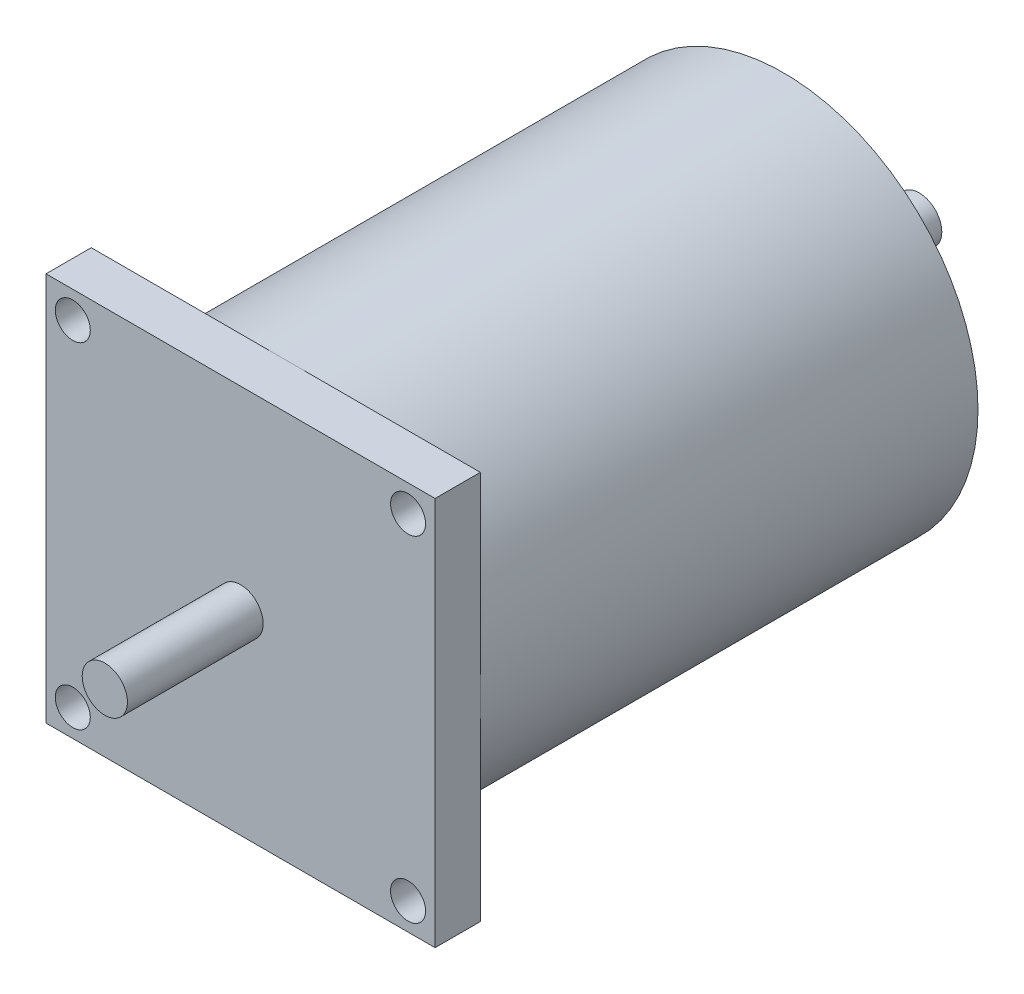
ISO-10303-21;
HEADER;
FILE_DESCRIPTION(('STEP AP214'),'2;1');
FILE_NAME('part.step','',(''),(''),'','','');
FILE_SCHEMA(('AUTOMOTIVE_DESIGN { 1 0 10303 214 1 1 1 1 }'));
ENDSEC;
DATA;
#1=APPLICATION_CONTEXT('core data for automotive mechanical design processes');
#2=APPLICATION_PROTOCOL_DEFINITION('international standard','automotive_design',2000,#1);
#3=PRODUCT_CONTEXT('',#1,'mechanical');
#4=PRODUCT('Part','Part','',(#3));
#5=PRODUCT_RELATED_PRODUCT_CATEGORY('part','',(#4));
#6=PRODUCT_DEFINITION_FORMATION('','',#4);
#7=PRODUCT_DEFINITION_CONTEXT('part definition',#1,'design');
#8=PRODUCT_DEFINITION('design','',#6,#7);
#9=PRODUCT_DEFINITION_SHAPE('','',#8);
#10=(LENGTH_UNIT() NAMED_UNIT(*) SI_UNIT(.MILLI.,.METRE.));
#11=(NAMED_UNIT(*) PLANE_ANGLE_UNIT() SI_UNIT($,.RADIAN.));
#12=(NAMED_UNIT(*) SI_UNIT($,.STERADIAN.) SOLID_ANGLE_UNIT());
#13=UNCERTAINTY_MEASURE_WITH_UNIT(LENGTH_MEASURE(1.E-05),#10,'distance_accuracy_value','');
#14=(GEOMETRIC_REPRESENTATION_CONTEXT(3) GLOBAL_UNCERTAINTY_ASSIGNED_CONTEXT((#13)) GLOBAL_UNIT_ASSIGNED_CONTEXT((#10,
#11,#12)) REPRESENTATION_CONTEXT('',''));
#15=CARTESIAN_POINT('',(0.,0.,0.));
#16=DIRECTION('',(0.,0.,1.));
#17=DIRECTION('',(1.,0.,0.));
#18=AXIS2_PLACEMENT_3D('',#15,#16,#17);
#19=CARTESIAN_POINT('',(0.,0.,0.));
#20=DIRECTION('',(0.,0.,1.));
#21=DIRECTION('',(1.,0.,0.));
#22=AXIS2_PLACEMENT_3D('',#19,#20,#21);
#23=PLANE('',#22);
#24=CARTESIAN_POINT('',(0.,0.,0.));
#25=DIRECTION('',(0.,0.,-1.));
#26=DIRECTION('',(-1.,0.,0.));
#27=AXIS2_PLACEMENT_3D('',#24,#25,#26);
#28=CIRCLE('',#27,27.305);
#29=CARTESIAN_POINT('',(-27.305,0.,0.));
#30=VERTEX_POINT('',#29);
#31=CARTESIAN_POINT('',(0.,27.305,0.));
#32=VERTEX_POINT('',#31);
#33=EDGE_CURVE('E43',#30,#32,#28,.T.);
#34=ORIENTED_EDGE('',*,*,#33,.F.);
#35=DIRECTION('',(0.,-1.,0.));
#36=VECTOR('',#35,1.);
#37=CARTESIAN_POINT('',(-27.305,27.305,0.));
#38=LINE('',#37,#36);
#39=CARTESIAN_POINT('',(-27.305,27.305,0.));
#40=VERTEX_POINT('',#39);
#41=EDGE_CURVE('E90',#40,#30,#38,.T.);
#42=ORIENTED_EDGE('',*,*,#41,.F.);
#43=DIRECTION('',(-1.,0.,0.));
#44=VECTOR('',#43,1.);
#45=CARTESIAN_POINT('',(-27.305,27.305,0.));
#46=LINE('',#45,#44);
#47=EDGE_CURVE('E109',#32,#40,#46,.T.);
#48=ORIENTED_EDGE('',*,*,#47,.F.);
#49=EDGE_LOOP('',(#34,#42,#48));
#50=FACE_BOUND('',#49,.T.);
#51=CARTESIAN_POINT('',(-23.5458,23.5458,0.));
#52=DIRECTION('',(0.,0.,1.));
#53=DIRECTION('',(1.,0.,0.));
#54=AXIS2_PLACEMENT_3D('',#51,#52,#53);
#55=CIRCLE('',#54,2.45745);
#56=CARTESIAN_POINT('',(-21.08835,23.5458,0.));
#57=VERTEX_POINT('',#56);
#58=EDGE_CURVE('E122',#57,#57,#55,.T.);
#59=ORIENTED_EDGE('',*,*,#58,.T.);
#60=EDGE_LOOP('',(#59));
#61=FACE_BOUND('',#60,.T.);
#62=ADVANCED_FACE('F32',(#50,#61),#23,.F.);
#63=CARTESIAN_POINT('',(27.305,0.,0.));
#64=VERTEX_POINT('',#63);
#65=EDGE_CURVE('E11',#32,#64,#28,.T.);
#66=ORIENTED_EDGE('',*,*,#65,.F.);
#67=CARTESIAN_POINT('',(27.305,27.305,0.));
#68=VERTEX_POINT('',#67);
#69=EDGE_CURVE('E146',#68,#32,#46,.T.);
#70=ORIENTED_EDGE('',*,*,#69,.F.);
#71=DIRECTION('',(0.,1.,0.));
#72=VECTOR('',#71,1.);
#73=CARTESIAN_POINT('',(27.305,27.305,0.));
#74=LINE('',#73,#72);
#75=EDGE_CURVE('E153',#64,#68,#74,.T.);
#76=ORIENTED_EDGE('',*,*,#75,.F.);
#77=EDGE_LOOP('',(#66,#70,#76));
#78=FACE_BOUND('',#77,.T.);
#79=CARTESIAN_POINT('',(23.5107420744024,23.5458000000026,0.));
#80=DIRECTION('',(0.,0.,1.));
#81=DIRECTION('',(1.,0.,0.));
#82=AXIS2_PLACEMENT_3D('',#79,#80,#81);
#83=CIRCLE('',#82,2.45745);
#84=CARTESIAN_POINT('',(25.9681920744024,23.5458000000026,0.));
#85=VERTEX_POINT('',#84);
#86=EDGE_CURVE('E128',#85,#85,#83,.T.);
#87=ORIENTED_EDGE('',*,*,#86,.T.);
#88=EDGE_LOOP('',(#87));
#89=FACE_BOUND('',#88,.T.);
#90=ADVANCED_FACE('F178',(#78,#89),#23,.F.);
#91=CARTESIAN_POINT('',(0.,-27.305,0.));
#92=VERTEX_POINT('',#91);
#93=EDGE_CURVE('E41',#64,#92,#28,.T.);
#94=ORIENTED_EDGE('',*,*,#93,.F.);
#95=CARTESIAN_POINT('',(27.305,-27.305,0.));
#96=VERTEX_POINT('',#95);
#97=EDGE_CURVE('E154',#96,#64,#74,.T.);
#98=ORIENTED_EDGE('',*,*,#97,.F.);
#99=DIRECTION('',(1.,0.,0.));
#100=VECTOR('',#99,1.);
#101=CARTESIAN_POINT('',(-27.305,-27.305,0.));
#102=LINE('',#101,#100);
#103=EDGE_CURVE('E99',#92,#96,#102,.T.);
#104=ORIENTED_EDGE('',*,*,#103,.F.);
#105=EDGE_LOOP('',(#94,#98,#104));
#106=FACE_BOUND('',#105,.T.);
#107=CARTESIAN_POINT('',(23.5107420744049,-23.5107420743998,0.));
#108=DIRECTION('',(0.,0.,1.));
#109=DIRECTION('',(1.,0.,0.));
#110=AXIS2_PLACEMENT_3D('',#107,#108,#109);
#111=CIRCLE('',#110,2.45745);
#112=CARTESIAN_POINT('',(25.9681920744049,-23.5107420743998,0.));
#113=VERTEX_POINT('',#112);
#114=EDGE_CURVE('E134',#113,#113,#111,.T.);
#115=ORIENTED_EDGE('',*,*,#114,.T.);
#116=EDGE_LOOP('',(#115));
#117=FACE_BOUND('',#116,.T.);
#118=ADVANCED_FACE('F168',(#106,#117),#23,.F.);
#119=CARTESIAN_POINT('',(-27.305,27.305,6.35));
#120=DIRECTION('',(1.,0.,0.));
#121=DIRECTION('',(0.,0.,-1.));
#122=AXIS2_PLACEMENT_3D('',#119,#120,#121);
#123=PLANE('',#122);
#124=ORIENTED_EDGE('',*,*,#41,.T.);
#125=CARTESIAN_POINT('',(-27.305,-27.305,0.));
#126=VERTEX_POINT('',#125);
#127=EDGE_CURVE('E92',#30,#126,#38,.T.);
#128=ORIENTED_EDGE('',*,*,#127,.T.);
#129=DIRECTION('',(0.,0.,-1.));
#130=VECTOR('',#129,1.);
#131=CARTESIAN_POINT('',(-27.305,-27.305,6.35));
#132=LINE('',#131,#130);
#133=CARTESIAN_POINT('',(-27.305,-27.305,6.35));
#134=VERTEX_POINT('',#133);
#135=EDGE_CURVE('E36',#134,#126,#132,.T.);
#136=ORIENTED_EDGE('',*,*,#135,.F.);
#137=DIRECTION('',(0.,-1.,0.));
#138=VECTOR('',#137,1.);
#139=CARTESIAN_POINT('',(-27.305,27.305,6.35));
#140=LINE('',#139,#138);
#141=CARTESIAN_POINT('',(-27.305,27.305,6.35));
#142=VERTEX_POINT('',#141);
#143=EDGE_CURVE('E142',#142,#134,#140,.T.);
#144=ORIENTED_EDGE('',*,*,#143,.F.);
#145=DIRECTION('',(0.,0.,-1.));
#146=VECTOR('',#145,1.);
#147=CARTESIAN_POINT('',(-27.305,27.305,6.35));
#148=LINE('',#147,#146);
#149=EDGE_CURVE('E95',#142,#40,#148,.T.);
#150=ORIENTED_EDGE('',*,*,#149,.T.);
#151=EDGE_LOOP('',(#124,#128,#136,#144,#150));
#152=FACE_BOUND('',#151,.T.);
#153=ADVANCED_FACE('F34',(#152),#123,.F.);
#154=CARTESIAN_POINT('',(-27.305,-27.305,6.35));
#155=DIRECTION('',(0.,1.,0.));
#156=DIRECTION('',(0.,0.,1.));
#157=AXIS2_PLACEMENT_3D('',#154,#155,#156);
#158=PLANE('',#157);
#159=EDGE_CURVE('E104',#126,#92,#102,.T.);
#160=ORIENTED_EDGE('',*,*,#159,.T.);
#161=ORIENTED_EDGE('',*,*,#103,.T.);
#162=DIRECTION('',(0.,0.,-1.));
#163=VECTOR('',#162,1.);
#164=CARTESIAN_POINT('',(27.305,-27.305,6.35));
#165=LINE('',#164,#163);
#166=CARTESIAN_POINT('',(27.305,-27.305,6.35));
#167=VERTEX_POINT('',#166);
#168=EDGE_CURVE('E115',#167,#96,#165,.T.);
#169=ORIENTED_EDGE('',*,*,#168,.F.);
#170=DIRECTION('',(1.,0.,0.));
#171=VECTOR('',#170,1.);
#172=CARTESIAN_POINT('',(-27.305,-27.305,6.35));
#173=LINE('',#172,#171);
#174=EDGE_CURVE('E145',#134,#167,#173,.T.);
#175=ORIENTED_EDGE('',*,*,#174,.F.);
#176=ORIENTED_EDGE('',*,*,#135,.T.);
#177=EDGE_LOOP('',(#160,#161,#169,#175,#176));
#178=FACE_BOUND('',#177,.T.);
#179=ADVANCED_FACE('F170',(#178),#158,.F.);
#180=CARTESIAN_POINT('',(27.305,27.305,6.35));
#181=DIRECTION('',(-1.,0.,0.));
#182=DIRECTION('',(0.,0.,1.));
#183=AXIS2_PLACEMENT_3D('',#180,#181,#182);
#184=PLANE('',#183);
#185=ORIENTED_EDGE('',*,*,#97,.T.);
#186=ORIENTED_EDGE('',*,*,#75,.T.);
#187=DIRECTION('',(0.,0.,-1.));
#188=VECTOR('',#187,1.);
#189=CARTESIAN_POINT('',(27.305,27.305,6.35));
#190=LINE('',#189,#188);
#191=CARTESIAN_POINT('',(27.305,27.305,6.35));
#192=VERTEX_POINT('',#191);
#193=EDGE_CURVE('E159',#192,#68,#190,.T.);
#194=ORIENTED_EDGE('',*,*,#193,.F.);
#195=DIRECTION('',(0.,1.,0.));
#196=VECTOR('',#195,1.);
#197=CARTESIAN_POINT('',(27.305,27.305,6.35));
#198=LINE('',#197,#196);
#199=EDGE_CURVE('E148',#167,#192,#198,.T.);
#200=ORIENTED_EDGE('',*,*,#199,.F.);
#201=ORIENTED_EDGE('',*,*,#168,.T.);
#202=EDGE_LOOP('',(#185,#186,#194,#200,#201));
#203=FACE_BOUND('',#202,.T.);
#204=ADVANCED_FACE('F165',(#203),#184,.F.);
#205=CARTESIAN_POINT('',(-27.305,27.305,6.35));
#206=DIRECTION('',(0.,-1.,0.));
#207=DIRECTION('',(0.,0.,-1.));
#208=AXIS2_PLACEMENT_3D('',#205,#206,#207);
#209=PLANE('',#208);
#210=ORIENTED_EDGE('',*,*,#69,.T.);
#211=ORIENTED_EDGE('',*,*,#47,.T.);
#212=ORIENTED_EDGE('',*,*,#149,.F.);
#213=DIRECTION('',(-1.,0.,0.));
#214=VECTOR('',#213,1.);
#215=CARTESIAN_POINT('',(-27.305,27.305,6.35));
#216=LINE('',#215,#214);
#217=EDGE_CURVE('E150',#192,#142,#216,.T.);
#218=ORIENTED_EDGE('',*,*,#217,.F.);
#219=ORIENTED_EDGE('',*,*,#193,.T.);
#220=EDGE_LOOP('',(#210,#211,#212,#218,#219));
#221=FACE_BOUND('',#220,.T.);
#222=ADVANCED_FACE('F175',(#221),#209,.F.);
#223=CARTESIAN_POINT('',(0.,0.,6.35));
#224=DIRECTION('',(0.,0.,1.));
#225=DIRECTION('',(1.,0.,0.));
#226=AXIS2_PLACEMENT_3D('',#223,#224,#225);
#227=PLANE('',#226);
#228=CARTESIAN_POINT('',(0.,0.,6.35));
#229=DIRECTION('',(0.,0.,1.));
#230=DIRECTION('',(1.,0.,0.));
#231=AXIS2_PLACEMENT_3D('',#228,#229,#230);
#232=CIRCLE('',#231,3.175);
#233=CARTESIAN_POINT('',(-3.175,0.,6.35));
#234=VERTEX_POINT('',#233);
#235=EDGE_CURVE('E366',#234,#234,#232,.T.);
#236=ORIENTED_EDGE('',*,*,#235,.F.);
#237=EDGE_LOOP('',(#236));
#238=FACE_BOUND('',#237,.T.);
#239=CARTESIAN_POINT('',(-23.5458,23.5458,6.35));
#240=DIRECTION('',(0.,0.,1.));
#241=DIRECTION('',(1.,0.,0.));
#242=AXIS2_PLACEMENT_3D('',#239,#240,#241);
#243=CIRCLE('',#242,2.45745);
#244=CARTESIAN_POINT('',(-21.08835,23.5458,6.35));
#245=VERTEX_POINT('',#244);
#246=EDGE_CURVE('E119',#245,#245,#243,.T.);
#247=ORIENTED_EDGE('',*,*,#246,.F.);
#248=EDGE_LOOP('',(#247));
#249=FACE_BOUND('',#248,.T.);
#250=CARTESIAN_POINT('',(23.5107420744024,23.5458000000026,6.35));
#251=DIRECTION('',(0.,0.,1.));
#252=DIRECTION('',(1.,0.,0.));
#253=AXIS2_PLACEMENT_3D('',#250,#251,#252);
#254=CIRCLE('',#253,2.45745);
#255=CARTESIAN_POINT('',(25.9681920744024,23.5458000000026,6.35));
#256=VERTEX_POINT('',#255);
#257=EDGE_CURVE('E125',#256,#256,#254,.T.);
#258=ORIENTED_EDGE('',*,*,#257,.F.);
#259=EDGE_LOOP('',(#258));
#260=FACE_BOUND('',#259,.T.);
#261=CARTESIAN_POINT('',(23.5107420744049,-23.5107420743998,6.35));
#262=DIRECTION('',(0.,0.,1.));
#263=DIRECTION('',(1.,0.,0.));
#264=AXIS2_PLACEMENT_3D('',#261,#262,#263);
#265=CIRCLE('',#264,2.45745);
#266=CARTESIAN_POINT('',(25.9681920744049,-23.5107420743998,6.35));
#267=VERTEX_POINT('',#266);
#268=EDGE_CURVE('E131',#267,#267,#265,.T.);
#269=ORIENTED_EDGE('',*,*,#268,.F.);
#270=EDGE_LOOP('',(#269));
#271=FACE_BOUND('',#270,.T.);
#272=CARTESIAN_POINT('',(-23.5457999999976,-23.5107420744021,6.35));
#273=DIRECTION('',(0.,0.,1.));
#274=DIRECTION('',(1.,0.,0.));
#275=AXIS2_PLACEMENT_3D('',#272,#273,#274);
#276=CIRCLE('',#275,2.45745);
#277=CARTESIAN_POINT('',(-21.0883499999976,-23.5107420744021,6.35));
#278=VERTEX_POINT('',#277);
#279=EDGE_CURVE('E137',#278,#278,#276,.T.);
#280=ORIENTED_EDGE('',*,*,#279,.F.);
#281=EDGE_LOOP('',(#280));
#282=FACE_BOUND('',#281,.T.);
#283=ORIENTED_EDGE('',*,*,#143,.T.);
#284=ORIENTED_EDGE('',*,*,#174,.T.);
#285=ORIENTED_EDGE('',*,*,#199,.T.);
#286=ORIENTED_EDGE('',*,*,#217,.T.);
#287=EDGE_LOOP('',(#283,#284,#285,#286));
#288=FACE_BOUND('',#287,.T.);
#289=ADVANCED_FACE('F172',(#238,#249,#260,#271,#282,#288),#227,.T.);
#290=EDGE_CURVE('E50',#92,#30,#28,.T.);
#291=ORIENTED_EDGE('',*,*,#290,.F.);
#292=ORIENTED_EDGE('',*,*,#159,.F.);
#293=ORIENTED_EDGE('',*,*,#127,.F.);
#294=EDGE_LOOP('',(#291,#292,#293));
#295=FACE_BOUND('',#294,.T.);
#296=CARTESIAN_POINT('',(-23.5457999999976,-23.5107420744021,0.));
#297=DIRECTION('',(0.,0.,1.));
#298=DIRECTION('',(1.,0.,0.));
#299=AXIS2_PLACEMENT_3D('',#296,#297,#298);
#300=CIRCLE('',#299,2.45745);
#301=CARTESIAN_POINT('',(-21.0883499999976,-23.5107420744021,0.));
#302=VERTEX_POINT('',#301);
#303=EDGE_CURVE('E106',#302,#302,#300,.T.);
#304=ORIENTED_EDGE('',*,*,#303,.T.);
#305=EDGE_LOOP('',(#304));
#306=FACE_BOUND('',#305,.T.);
#307=ADVANCED_FACE('F101',(#295,#306),#23,.F.);
#308=CARTESIAN_POINT('',(-23.5457999999976,-23.5107420744021,6.35));
#309=DIRECTION('',(0.,0.,1.));
#310=DIRECTION('',(1.,0.,0.));
#311=AXIS2_PLACEMENT_3D('',#308,#309,#310);
#312=CYLINDRICAL_SURFACE('',#311,2.45745);
#313=ORIENTED_EDGE('',*,*,#303,.F.);
#314=EDGE_LOOP('',(#313));
#315=FACE_BOUND('',#314,.T.);
#316=ORIENTED_EDGE('',*,*,#279,.T.);
#317=EDGE_LOOP('',(#316));
#318=FACE_BOUND('',#317,.T.);
#319=ADVANCED_FACE('F200',(#315,#318),#312,.F.);
#320=CARTESIAN_POINT('',(23.5107420744049,-23.5107420743998,6.35));
#321=DIRECTION('',(0.,0.,1.));
#322=DIRECTION('',(1.,0.,0.));
#323=AXIS2_PLACEMENT_3D('',#320,#321,#322);
#324=CYLINDRICAL_SURFACE('',#323,2.45745);
#325=ORIENTED_EDGE('',*,*,#114,.F.);
#326=EDGE_LOOP('',(#325));
#327=FACE_BOUND('',#326,.T.);
#328=ORIENTED_EDGE('',*,*,#268,.T.);
#329=EDGE_LOOP('',(#328));
#330=FACE_BOUND('',#329,.T.);
#331=ADVANCED_FACE('F188',(#327,#330),#324,.F.);
#332=CARTESIAN_POINT('',(23.5107420744024,23.5458000000026,6.35));
#333=DIRECTION('',(0.,0.,1.));
#334=DIRECTION('',(1.,0.,0.));
#335=AXIS2_PLACEMENT_3D('',#332,#333,#334);
#336=CYLINDRICAL_SURFACE('',#335,2.45745);
#337=ORIENTED_EDGE('',*,*,#86,.F.);
#338=EDGE_LOOP('',(#337));
#339=FACE_BOUND('',#338,.T.);
#340=ORIENTED_EDGE('',*,*,#257,.T.);
#341=EDGE_LOOP('',(#340));
#342=FACE_BOUND('',#341,.T.);
#343=ADVANCED_FACE('F184',(#339,#342),#336,.F.);
#344=CARTESIAN_POINT('',(-23.5458,23.5458,6.35));
#345=DIRECTION('',(0.,0.,1.));
#346=DIRECTION('',(1.,0.,0.));
#347=AXIS2_PLACEMENT_3D('',#344,#345,#346);
#348=CYLINDRICAL_SURFACE('',#347,2.45745);
#349=ORIENTED_EDGE('',*,*,#58,.F.);
#350=EDGE_LOOP('',(#349));
#351=FACE_BOUND('',#350,.T.);
#352=ORIENTED_EDGE('',*,*,#246,.T.);
#353=EDGE_LOOP('',(#352));
#354=FACE_BOUND('',#353,.T.);
#355=ADVANCED_FACE('F187',(#351,#354),#348,.F.);
#356=CARTESIAN_POINT('',(0.,0.,-69.85));
#357=DIRECTION('',(0.,0.,1.));
#358=DIRECTION('',(1.,0.,0.));
#359=AXIS2_PLACEMENT_3D('',#356,#357,#358);
#360=CYLINDRICAL_SURFACE('',#359,27.305);
#361=CARTESIAN_POINT('',(0.,0.,-69.85));
#362=DIRECTION('',(0.,0.,-1.));
#363=DIRECTION('',(-1.,0.,0.));
#364=AXIS2_PLACEMENT_3D('',#361,#362,#363);
#365=CIRCLE('',#364,27.305);
#366=CARTESIAN_POINT('',(-27.305,0.,-69.85));
#367=VERTEX_POINT('',#366);
#368=EDGE_CURVE('E112',#367,#367,#365,.T.);
#369=ORIENTED_EDGE('',*,*,#368,.F.);
#370=EDGE_LOOP('',(#369));
#371=FACE_BOUND('',#370,.T.);
#372=ORIENTED_EDGE('',*,*,#33,.T.);
#373=ORIENTED_EDGE('',*,*,#65,.T.);
#374=ORIENTED_EDGE('',*,*,#93,.T.);
#375=ORIENTED_EDGE('',*,*,#290,.T.);
#376=EDGE_LOOP('',(#372,#373,#374,#375));
#377=FACE_BOUND('',#376,.T.);
#378=ADVANCED_FACE('F114',(#371,#377),#360,.T.);
#379=CARTESIAN_POINT('',(0.,0.,-69.85));
#380=DIRECTION('',(0.,0.,-1.));
#381=DIRECTION('',(-1.,0.,0.));
#382=AXIS2_PLACEMENT_3D('',#379,#380,#381);
#383=PLANE('',#382);
#384=CARTESIAN_POINT('',(0.,0.,-69.85));
#385=DIRECTION('',(0.,0.,-1.));
#386=DIRECTION('',(-1.,0.,0.));
#387=AXIS2_PLACEMENT_3D('',#384,#385,#386);
#388=CIRCLE('',#387,3.175);
#389=CARTESIAN_POINT('',(3.175,0.,-69.85));
#390=VERTEX_POINT('',#389);
#391=EDGE_CURVE('E361',#390,#390,#388,.T.);
#392=ORIENTED_EDGE('',*,*,#391,.F.);
#393=EDGE_LOOP('',(#392));
#394=FACE_BOUND('',#393,.T.);
#395=ORIENTED_EDGE('',*,*,#368,.T.);
#396=EDGE_LOOP('',(#395));
#397=FACE_BOUND('',#396,.T.);
#398=ADVANCED_FACE('F332',(#394,#397),#383,.T.);
#399=CARTESIAN_POINT('',(0.,0.,-88.9));
#400=DIRECTION('',(0.,0.,1.));
#401=DIRECTION('',(1.,0.,0.));
#402=AXIS2_PLACEMENT_3D('',#399,#400,#401);
#403=CYLINDRICAL_SURFACE('',#402,3.175);
#404=CARTESIAN_POINT('',(0.,0.,-88.9));
#405=DIRECTION('',(0.,0.,-1.));
#406=DIRECTION('',(-1.,0.,0.));
#407=AXIS2_PLACEMENT_3D('',#404,#405,#406);
#408=CIRCLE('',#407,3.175);
#409=CARTESIAN_POINT('',(3.175,0.,-88.9));
#410=VERTEX_POINT('',#409);
#411=EDGE_CURVE('E113',#410,#410,#408,.T.);
#412=CARTESIAN_POINT('',(3.175,0.,-88.9));
#413=CARTESIAN_POINT('',(3.175,0.,-88.7015625));
#414=CARTESIAN_POINT('',(3.175,0.,-88.503125));
#415=CARTESIAN_POINT('',(3.175,0.,-88.10625));
#416=CARTESIAN_POINT('',(3.175,0.,-87.9078125));
#417=CARTESIAN_POINT('',(3.175,0.,-87.5109375));
#418=CARTESIAN_POINT('',(3.175,0.,-87.3125));
#419=CARTESIAN_POINT('',(3.175,0.,-86.915625));
#420=CARTESIAN_POINT('',(3.175,0.,-86.7171875));
#421=CARTESIAN_POINT('',(3.175,0.,-86.3203125));
#422=CARTESIAN_POINT('',(3.175,0.,-86.121875));
#423=CARTESIAN_POINT('',(3.175,0.,-85.725));
#424=CARTESIAN_POINT('',(3.175,0.,-85.5265625));
#425=CARTESIAN_POINT('',(3.175,0.,-85.1296875));
#426=CARTESIAN_POINT('',(3.175,0.,-84.93125));
#427=CARTESIAN_POINT('',(3.175,0.,-84.534375));
#428=CARTESIAN_POINT('',(3.175,0.,-84.3359375));
#429=CARTESIAN_POINT('',(3.175,0.,-83.9390625));
#430=CARTESIAN_POINT('',(3.175,0.,-83.740625));
#431=CARTESIAN_POINT('',(3.175,0.,-83.34375));
#432=CARTESIAN_POINT('',(3.175,0.,-83.1453125));
#433=CARTESIAN_POINT('',(3.175,0.,-82.7484375));
#434=CARTESIAN_POINT('',(3.175,0.,-82.55));
#435=CARTESIAN_POINT('',(3.175,0.,-82.153125));
#436=CARTESIAN_POINT('',(3.175,0.,-81.9546875));
#437=CARTESIAN_POINT('',(3.175,0.,-81.5578125));
#438=CARTESIAN_POINT('',(3.175,0.,-81.359375));
#439=CARTESIAN_POINT('',(3.175,0.,-80.9625));
#440=CARTESIAN_POINT('',(3.175,0.,-80.7640625));
#441=CARTESIAN_POINT('',(3.175,0.,-80.3671875));
#442=CARTESIAN_POINT('',(3.175,0.,-80.16875));
#443=CARTESIAN_POINT('',(3.175,0.,-79.771875));
#444=CARTESIAN_POINT('',(3.175,0.,-79.5734375));
#445=CARTESIAN_POINT('',(3.175,0.,-79.1765625));
#446=CARTESIAN_POINT('',(3.175,0.,-78.978125));
#447=CARTESIAN_POINT('',(3.175,0.,-78.58125));
#448=CARTESIAN_POINT('',(3.175,0.,-78.3828125));
#449=CARTESIAN_POINT('',(3.175,0.,-77.9859375));
#450=CARTESIAN_POINT('',(3.175,0.,-77.7875));
#451=CARTESIAN_POINT('',(3.175,0.,-77.390625));
#452=CARTESIAN_POINT('',(3.175,0.,-77.1921875));
#453=CARTESIAN_POINT('',(3.175,0.,-76.7953125));
#454=CARTESIAN_POINT('',(3.175,0.,-76.596875));
#455=CARTESIAN_POINT('',(3.175,0.,-76.2));
#456=CARTESIAN_POINT('',(3.175,0.,-76.0015625));
#457=CARTESIAN_POINT('',(3.175,0.,-75.6046875));
#458=CARTESIAN_POINT('',(3.175,0.,-75.40625));
#459=CARTESIAN_POINT('',(3.175,0.,-75.009375));
#460=CARTESIAN_POINT('',(3.175,0.,-74.8109375));
#461=CARTESIAN_POINT('',(3.175,0.,-74.4140625));
#462=CARTESIAN_POINT('',(3.175,0.,-74.215625));
#463=CARTESIAN_POINT('',(3.175,0.,-73.81875));
#464=CARTESIAN_POINT('',(3.175,0.,-73.6203125));
#465=CARTESIAN_POINT('',(3.175,0.,-73.2234375));
#466=CARTESIAN_POINT('',(3.175,0.,-73.025));
#467=CARTESIAN_POINT('',(3.175,0.,-72.628125));
#468=CARTESIAN_POINT('',(3.175,0.,-72.4296875));
#469=CARTESIAN_POINT('',(3.175,0.,-72.0328125));
#470=CARTESIAN_POINT('',(3.175,0.,-71.834375));
#471=CARTESIAN_POINT('',(3.175,0.,-71.4375));
#472=CARTESIAN_POINT('',(3.175,0.,-71.2390625));
#473=CARTESIAN_POINT('',(3.175,0.,-70.8421875));
#474=CARTESIAN_POINT('',(3.175,0.,-70.64375));
#475=CARTESIAN_POINT('',(3.175,0.,-70.246875));
#476=CARTESIAN_POINT('',(3.175,0.,-70.0484375));
#477=CARTESIAN_POINT('',(3.175,0.,-69.85));
#478=B_SPLINE_CURVE_WITH_KNOTS('',3,(#412,#413,#414,#415,#416,#417,#418,#419,#420,#421,#422,
#423,#424,#425,#426,#427,#428,#429,#430,#431,#432,#433,#434,#435,#436,#437,#438,#439,#440,#441,
#442,#443,#444,#445,#446,#447,#448,#449,#450,#451,#452,#453,#454,#455,#456,#457,#458,#459,#460,
#461,#462,#463,#464,#465,#466,#467,#468,#469,#470,#471,#472,#473,#474,#475,#476,#477),
.UNSPECIFIED.,.F.,.F.,(4,2,2,2,2,2,2,2,2,2,2,2,2,2,2,2,2,2,2,2,2,2,2,2,2,2,2,2,2,2,2,2,4),(0.,
0.5953125,1.190625,1.7859375,2.38125,2.9765625,3.571875,4.1671875,4.7625,5.3578125,5.953125,
6.5484375,7.14375,7.7390625,8.334375,8.92968750000001,9.52500000000001,10.1203125,10.715625,
11.3109375,11.90625,12.5015625,13.096875,13.6921875,14.2875,14.8828125,15.478125,16.0734375,
16.66875,17.2640625,17.859375,18.4546875,19.05),.UNSPECIFIED.);
#479=EDGE_CURVE('BSEAM328',#410,#390,#478,.T.);
#480=ORIENTED_EDGE('',*,*,#411,.F.);
#481=ORIENTED_EDGE('',*,*,#391,.T.);
#482=ORIENTED_EDGE('',*,*,#479,.T.);
#483=ORIENTED_EDGE('',*,*,#479,.F.);
#484=EDGE_LOOP('',(#480,#482,#481,#483));
#485=FACE_BOUND('',#484,.T.);
#486=ADVANCED_FACE('F328',(#485),#403,.T.);
#487=CARTESIAN_POINT('',(0.,0.,-88.9));
#488=DIRECTION('',(0.,0.,-1.));
#489=DIRECTION('',(-1.,0.,0.));
#490=AXIS2_PLACEMENT_3D('',#487,#488,#489);
#491=PLANE('',#490);
#492=ORIENTED_EDGE('',*,*,#411,.T.);
#493=EDGE_LOOP('',(#492));
#494=FACE_BOUND('',#493,.T.);
#495=ADVANCED_FACE('F301',(#494),#491,.T.);
#496=CARTESIAN_POINT('',(0.,0.,25.4));
#497=DIRECTION('',(0.,0.,-1.));
#498=DIRECTION('',(-1.,0.,0.));
#499=AXIS2_PLACEMENT_3D('',#496,#497,#498);
#500=CYLINDRICAL_SURFACE('',#499,3.175);
#501=CARTESIAN_POINT('',(0.,0.,25.4));
#502=DIRECTION('',(0.,0.,1.));
#503=DIRECTION('',(1.,0.,0.));
#504=AXIS2_PLACEMENT_3D('',#501,#502,#503);
#505=CIRCLE('',#504,3.175);
#506=CARTESIAN_POINT('',(-3.175,0.,25.4));
#507=VERTEX_POINT('',#506);
#508=EDGE_CURVE('E363',#507,#507,#505,.T.);
#509=CARTESIAN_POINT('',(-3.175,0.,25.4));
#510=CARTESIAN_POINT('',(-3.175,0.,25.2015625));
#511=CARTESIAN_POINT('',(-3.175,0.,25.003125));
#512=CARTESIAN_POINT('',(-3.175,0.,24.60625));
#513=CARTESIAN_POINT('',(-3.175,0.,24.4078125));
#514=CARTESIAN_POINT('',(-3.175,0.,24.0109375));
#515=CARTESIAN_POINT('',(-3.175,0.,23.8125));
#516=CARTESIAN_POINT('',(-3.175,0.,23.415625));
#517=CARTESIAN_POINT('',(-3.175,0.,23.2171875));
#518=CARTESIAN_POINT('',(-3.175,0.,22.8203125));
#519=CARTESIAN_POINT('',(-3.175,0.,22.621875));
#520=CARTESIAN_POINT('',(-3.175,0.,22.225));
#521=CARTESIAN_POINT('',(-3.175,0.,22.0265625));
#522=CARTESIAN_POINT('',(-3.175,0.,21.6296875));
#523=CARTESIAN_POINT('',(-3.175,0.,21.43125));
#524=CARTESIAN_POINT('',(-3.175,0.,21.034375));
#525=CARTESIAN_POINT('',(-3.175,0.,20.8359375));
#526=CARTESIAN_POINT('',(-3.175,0.,20.4390625));
#527=CARTESIAN_POINT('',(-3.175,0.,20.240625));
#528=CARTESIAN_POINT('',(-3.175,0.,19.84375));
#529=CARTESIAN_POINT('',(-3.175,0.,19.6453125));
#530=CARTESIAN_POINT('',(-3.175,0.,19.2484375));
#531=CARTESIAN_POINT('',(-3.175,0.,19.05));
#532=CARTESIAN_POINT('',(-3.175,0.,18.653125));
#533=CARTESIAN_POINT('',(-3.175,0.,18.4546875));
#534=CARTESIAN_POINT('',(-3.175,0.,18.0578125));
#535=CARTESIAN_POINT('',(-3.175,0.,17.859375));
#536=CARTESIAN_POINT('',(-3.175,0.,17.4625));
#537=CARTESIAN_POINT('',(-3.175,0.,17.2640625));
#538=CARTESIAN_POINT('',(-3.175,0.,16.8671875));
#539=CARTESIAN_POINT('',(-3.175,0.,16.66875));
#540=CARTESIAN_POINT('',(-3.175,0.,16.271875));
#541=CARTESIAN_POINT('',(-3.175,0.,16.0734375));
#542=CARTESIAN_POINT('',(-3.175,0.,15.6765625));
#543=CARTESIAN_POINT('',(-3.175,0.,15.478125));
#544=CARTESIAN_POINT('',(-3.175,0.,15.08125));
#545=CARTESIAN_POINT('',(-3.175,0.,14.8828125));
#546=CARTESIAN_POINT('',(-3.175,0.,14.4859375));
#547=CARTESIAN_POINT('',(-3.175,0.,14.2875));
#548=CARTESIAN_POINT('',(-3.175,0.,13.890625));
#549=CARTESIAN_POINT('',(-3.175,0.,13.6921875));
#550=CARTESIAN_POINT('',(-3.175,0.,13.2953125));
#551=CARTESIAN_POINT('',(-3.175,0.,13.096875));
#552=CARTESIAN_POINT('',(-3.175,0.,12.7));
#553=CARTESIAN_POINT('',(-3.175,0.,12.5015625));
#554=CARTESIAN_POINT('',(-3.175,0.,12.1046875));
#555=CARTESIAN_POINT('',(-3.175,0.,11.90625));
#556=CARTESIAN_POINT('',(-3.175,0.,11.509375));
#557=CARTESIAN_POINT('',(-3.175,0.,11.3109375));
#558=CARTESIAN_POINT('',(-3.175,0.,10.9140625));
#559=CARTESIAN_POINT('',(-3.175,0.,10.715625));
#560=CARTESIAN_POINT('',(-3.175,0.,10.31875));
#561=CARTESIAN_POINT('',(-3.175,0.,10.1203125));
#562=CARTESIAN_POINT('',(-3.175,0.,9.7234375));
#563=CARTESIAN_POINT('',(-3.175,0.,9.525));
#564=CARTESIAN_POINT('',(-3.175,0.,9.128125));
#565=CARTESIAN_POINT('',(-3.175,0.,8.9296875));
#566=CARTESIAN_POINT('',(-3.175,0.,8.5328125));
#567=CARTESIAN_POINT('',(-3.175,0.,8.334375));
#568=CARTESIAN_POINT('',(-3.175,0.,7.9375));
#569=CARTESIAN_POINT('',(-3.175,0.,7.7390625));
#570=CARTESIAN_POINT('',(-3.175,0.,7.3421875));
#571=CARTESIAN_POINT('',(-3.175,0.,7.14375));
#572=CARTESIAN_POINT('',(-3.175,0.,6.746875));
#573=CARTESIAN_POINT('',(-3.175,0.,6.5484375));
#574=CARTESIAN_POINT('',(-3.175,0.,6.35));
#575=B_SPLINE_CURVE_WITH_KNOTS('',3,(#509,#510,#511,#512,#513,#514,#515,#516,#517,#518,#519,
#520,#521,#522,#523,#524,#525,#526,#527,#528,#529,#530,#531,#532,#533,#534,#535,#536,#537,#538,
#539,#540,#541,#542,#543,#544,#545,#546,#547,#548,#549,#550,#551,#552,#553,#554,#555,#556,#557,
#558,#559,#560,#561,#562,#563,#564,#565,#566,#567,#568,#569,#570,#571,#572,#573,#574),
.UNSPECIFIED.,.F.,.F.,(4,2,2,2,2,2,2,2,2,2,2,2,2,2,2,2,2,2,2,2,2,2,2,2,2,2,2,2,2,2,2,2,4),(0.,
0.595312499999997,1.190625,1.7859375,2.38125,2.9765625,3.571875,4.1671875,4.7625,5.3578125,
5.953125,6.5484375,7.14375,7.7390625,8.33437499999999,8.92968749999999,9.525,10.1203125,
10.715625,11.3109375,11.90625,12.5015625,13.096875,13.6921875,14.2875,14.8828125,15.478125,
16.0734375,16.66875,17.2640625,17.859375,18.4546875,19.05),.UNSPECIFIED.);
#576=EDGE_CURVE('BSEAM306',#507,#234,#575,.T.);
#577=ORIENTED_EDGE('',*,*,#508,.F.);
#578=ORIENTED_EDGE('',*,*,#235,.T.);
#579=ORIENTED_EDGE('',*,*,#576,.T.);
#580=ORIENTED_EDGE('',*,*,#576,.F.);
#581=EDGE_LOOP('',(#577,#579,#578,#580));
#582=FACE_BOUND('',#581,.T.);
#583=ADVANCED_FACE('F306',(#582),#500,.T.);
#584=CARTESIAN_POINT('',(0.,0.,25.4));
#585=DIRECTION('',(0.,0.,1.));
#586=DIRECTION('',(1.,0.,0.));
#587=AXIS2_PLACEMENT_3D('',#584,#585,#586);
#588=PLANE('',#587);
#589=ORIENTED_EDGE('',*,*,#508,.T.);
#590=EDGE_LOOP('',(#589));
#591=FACE_BOUND('',#590,.T.);
#592=ADVANCED_FACE('F311',(#591),#588,.T.);
#593=CLOSED_SHELL('',(#62,#90,#118,#153,#179,#204,#222,#289,#307,#319,#331,#343,#355,#378,#398,
#486,#495,#583,#592));
#594=MANIFOLD_SOLID_BREP('B2',#593);
#595=ADVANCED_BREP_SHAPE_REPRESENTATION('',(#18,#594),#14);
#596=SHAPE_DEFINITION_REPRESENTATION(#9,#595);
ENDSEC;
END-ISO-10303-21;
